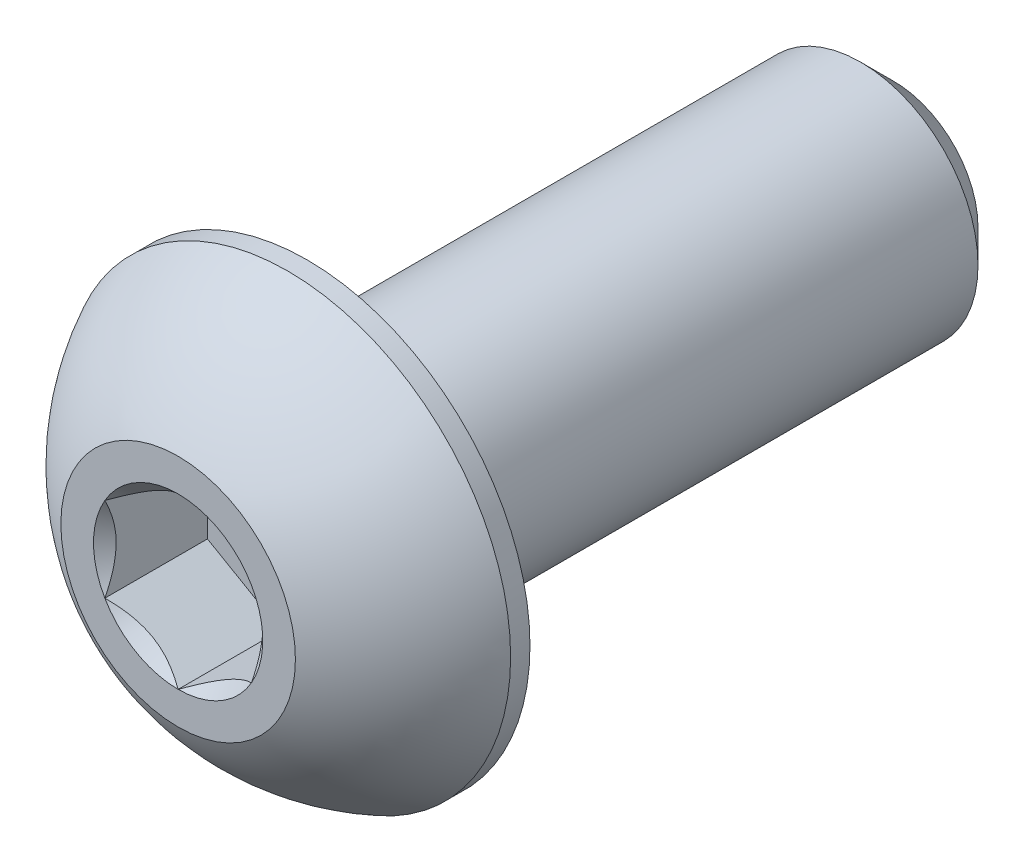
ISO-10303-21;
HEADER;
FILE_DESCRIPTION(('STEP AP214'),'2;1');
FILE_NAME('part.step','',(''),(''),'','','');
FILE_SCHEMA(('AUTOMOTIVE_DESIGN { 1 0 10303 214 1 1 1 1 }'));
ENDSEC;
DATA;
#1=APPLICATION_CONTEXT('core data for automotive mechanical design processes');
#2=APPLICATION_PROTOCOL_DEFINITION('international standard','automotive_design',2000,#1);
#3=PRODUCT_CONTEXT('',#1,'mechanical');
#4=PRODUCT('Part','Part','',(#3));
#5=PRODUCT_RELATED_PRODUCT_CATEGORY('part','',(#4));
#6=PRODUCT_DEFINITION_FORMATION('','',#4);
#7=PRODUCT_DEFINITION_CONTEXT('part definition',#1,'design');
#8=PRODUCT_DEFINITION('design','',#6,#7);
#9=PRODUCT_DEFINITION_SHAPE('','',#8);
#10=(LENGTH_UNIT() NAMED_UNIT(*) SI_UNIT(.MILLI.,.METRE.));
#11=(NAMED_UNIT(*) PLANE_ANGLE_UNIT() SI_UNIT($,.RADIAN.));
#12=(NAMED_UNIT(*) SI_UNIT($,.STERADIAN.) SOLID_ANGLE_UNIT());
#13=UNCERTAINTY_MEASURE_WITH_UNIT(LENGTH_MEASURE(1.E-05),#10,'distance_accuracy_value','');
#14=(GEOMETRIC_REPRESENTATION_CONTEXT(3) GLOBAL_UNCERTAINTY_ASSIGNED_CONTEXT((#13)) GLOBAL_UNIT_ASSIGNED_CONTEXT((#10,
#11,#12)) REPRESENTATION_CONTEXT('',''));
#15=CARTESIAN_POINT('',(0.,0.,0.));
#16=DIRECTION('',(0.,0.,1.));
#17=DIRECTION('',(1.,0.,0.));
#18=AXIS2_PLACEMENT_3D('',#15,#16,#17);
#19=CARTESIAN_POINT('',(0.,0.,6.1));
#20=DIRECTION('',(0.,0.,-1.));
#21=DIRECTION('',(-1.,0.,0.));
#22=AXIS2_PLACEMENT_3D('',#19,#20,#21);
#23=PLANE('',#22);
#24=CARTESIAN_POINT('',(0.,0.,6.1));
#25=DIRECTION('',(0.,0.,1.));
#26=DIRECTION('',(1.,0.,0.));
#27=AXIS2_PLACEMENT_3D('',#24,#25,#26);
#28=CIRCLE('',#27,1.44337567297406);
#29=CARTESIAN_POINT('',(-1.25,0.721687836487033,6.1));
#30=VERTEX_POINT('',#29);
#31=CARTESIAN_POINT('',(-1.25,-0.721687836487033,6.1));
#32=VERTEX_POINT('',#31);
#33=EDGE_CURVE('E138',#30,#32,#28,.T.);
#34=ORIENTED_EDGE('',*,*,#33,.F.);
#35=CARTESIAN_POINT('',(0.,1.44337567297406,6.1));
#36=VERTEX_POINT('',#35);
#37=EDGE_CURVE('E110',#36,#30,#28,.T.);
#38=ORIENTED_EDGE('',*,*,#37,.F.);
#39=CARTESIAN_POINT('',(1.25,0.721687836487032,6.1));
#40=VERTEX_POINT('',#39);
#41=EDGE_CURVE('E101',#40,#36,#28,.T.);
#42=ORIENTED_EDGE('',*,*,#41,.F.);
#43=CARTESIAN_POINT('',(1.25,-0.721687836487032,6.1));
#44=VERTEX_POINT('',#43);
#45=EDGE_CURVE('E62',#44,#40,#28,.T.);
#46=ORIENTED_EDGE('',*,*,#45,.F.);
#47=CARTESIAN_POINT('',(0.,-1.44337567297406,6.1));
#48=VERTEX_POINT('',#47);
#49=EDGE_CURVE('E69',#48,#44,#28,.T.);
#50=ORIENTED_EDGE('',*,*,#49,.F.);
#51=EDGE_CURVE('E139',#32,#48,#28,.T.);
#52=ORIENTED_EDGE('',*,*,#51,.F.);
#53=EDGE_LOOP('',(#34,#38,#42,#46,#50,#52));
#54=FACE_BOUND('',#53,.T.);
#55=CARTESIAN_POINT('',(0.,0.,6.1));
#56=DIRECTION('',(0.,0.,1.));
#57=DIRECTION('',(1.,0.,0.));
#58=AXIS2_PLACEMENT_3D('',#55,#56,#57);
#59=CIRCLE('',#58,2.);
#60=CARTESIAN_POINT('',(0.,2.,6.1));
#61=VERTEX_POINT('',#60);
#62=EDGE_CURVE('E56',#61,#61,#59,.T.);
#63=ORIENTED_EDGE('',*,*,#62,.T.);
#64=EDGE_LOOP('',(#63));
#65=FACE_BOUND('',#64,.T.);
#66=ADVANCED_FACE('F43',(#54,#65),#23,.F.);
#67=CARTESIAN_POINT('',(0.,0.,2.37355614973262));
#68=DIRECTION('',(0.,0.,1.));
#69=DIRECTION('',(0.,1.,0.));
#70=AXIS2_PLACEMENT_3D('',#67,#68,#69);
#71=SPHERICAL_SURFACE('',#70,4.22922968981298);
#72=CARTESIAN_POINT('',(0.,0.,4.23));
#73=DIRECTION('',(0.,0.,1.));
#74=DIRECTION('',(1.,0.,0.));
#75=AXIS2_PLACEMENT_3D('',#72,#73,#74);
#76=CIRCLE('',#75,3.8);
#77=CARTESIAN_POINT('',(0.,3.8,4.23));
#78=VERTEX_POINT('',#77);
#79=EDGE_CURVE('E221',#78,#78,#76,.T.);
#80=CARTESIAN_POINT('',(0.,2.,6.1));
#81=CARTESIAN_POINT('',(0.,2.02421343985614,6.08700457403551));
#82=CARTESIAN_POINT('',(0.,2.04830018323974,6.07377308703487));
#83=CARTESIAN_POINT('',(0.,2.09621120342126,6.04684315849425));
#84=CARTESIAN_POINT('',(0.,2.12003548021917,6.03314471695428));
#85=CARTESIAN_POINT('',(0.,2.16741249358867,6.00528604686797));
#86=CARTESIAN_POINT('',(0.,2.19096523016026,5.99112581832164));
#87=CARTESIAN_POINT('',(0.,2.23779021933682,5.96234896476405));
#88=CARTESIAN_POINT('',(0.,2.2610624719418,5.94773233975278));
#89=CARTESIAN_POINT('',(0.,2.30731764886072,5.91804824448586));
#90=CARTESIAN_POINT('',(0.,2.33030057317465,5.90298077423021));
#91=CARTESIAN_POINT('',(0.,2.37596836104235,5.87240071441713));
#92=CARTESIAN_POINT('',(0.,2.39865322459612,5.85688812485971));
#93=CARTESIAN_POINT('',(0.,2.44371627121513,5.82542372060412));
#94=CARTESIAN_POINT('',(0.,2.46609445428038,5.80947190590595));
#95=CARTESIAN_POINT('',(0.,2.51053563686181,5.77713511266833));
#96=CARTESIAN_POINT('',(0.,2.532598636378,5.76075013412888));
#97=CARTESIAN_POINT('',(0.,2.57640106852492,5.72755323903277));
#98=CARTESIAN_POINT('',(0.,2.59814050115564,5.71074132247611));
#99=CARTESIAN_POINT('',(0.,2.64128753915153,5.67669693941185));
#100=CARTESIAN_POINT('',(0.,2.66269514451671,5.65946447290426));
#101=CARTESIAN_POINT('',(0.,2.70517039368395,5.62458553779704));
#102=CARTESIAN_POINT('',(0.,2.72623803748602,5.6069390691974));
#103=CARTESIAN_POINT('',(0.,2.76802535840618,5.57123883507559));
#104=CARTESIAN_POINT('',(0.,2.78874503552428,5.55318506955341));
#105=CARTESIAN_POINT('',(0.,2.82982855017313,5.51667710151719));
#106=CARTESIAN_POINT('',(0.,2.85019238770389,5.49822289900316));
#107=CARTESIAN_POINT('',(0.,2.89055648548394,5.46092106906898));
#108=CARTESIAN_POINT('',(0.,2.91055674573324,5.44207344164884));
#109=CARTESIAN_POINT('',(0.,2.95018608940553,5.40399192347874));
#110=CARTESIAN_POINT('',(0.,2.96981517282852,5.38475803272878));
#111=CARTESIAN_POINT('',(0.,3.00869470434027,5.34591129624471));
#112=CARTESIAN_POINT('',(0.,3.02794515242903,5.3262984505106));
#113=CARTESIAN_POINT('',(0.,3.06606009863533,5.28670125639628));
#114=CARTESIAN_POINT('',(0.,3.08492459675287,5.26671690801607));
#115=CARTESIAN_POINT('',(0.,3.12226047503002,5.22638430210832));
#116=CARTESIAN_POINT('',(0.,3.14073185518965,5.20603604458079));
#117=CARTESIAN_POINT('',(0.,3.17727447893821,5.16498335215256));
#118=CARTESIAN_POINT('',(0.,3.19534572252715,5.14427891725186));
#119=CARTESIAN_POINT('',(0.,3.23108120656242,5.10252173718901));
#120=CARTESIAN_POINT('',(0.,3.24874544700875,5.08146899202686));
#121=CARTESIAN_POINT('',(0.,3.28366021283673,5.03902319090103));
#122=CARTESIAN_POINT('',(0.,3.30091073821838,5.01763013493736));
#123=CARTESIAN_POINT('',(0.,3.33499151919534,4.97451184097717));
#124=CARTESIAN_POINT('',(0.,3.35182177479064,4.95278660298064));
#125=CARTESIAN_POINT('',(0.,3.38505562116371,4.9090121999432));
#126=CARTESIAN_POINT('',(0.,3.40145921194149,4.88696303490229));
#127=CARTESIAN_POINT('',(0.,3.43383349577047,4.84254915584848));
#128=CARTESIAN_POINT('',(0.,3.44980418882166,4.8201844418356));
#129=CARTESIAN_POINT('',(0.,3.48130660877275,4.77514796280767));
#130=CARTESIAN_POINT('',(0.,3.49683833567264,4.75247619779264));
#131=CARTESIAN_POINT('',(0.,3.52745692170931,4.70683423141033));
#132=CARTESIAN_POINT('',(0.,3.5425437808461,4.68386403004306));
#133=CARTESIAN_POINT('',(0.,3.57226689871518,4.63763391896935));
#134=CARTESIAN_POINT('',(0.,3.58690315744748,4.61437400926291));
#135=CARTESIAN_POINT('',(0.,3.61571951333199,4.56757331973341));
#136=CARTESIAN_POINT('',(0.,3.62989961048422,4.54403253991033));
#137=CARTESIAN_POINT('',(0.,3.65779825442823,4.4966790546141));
#138=CARTESIAN_POINT('',(0.,3.67151680122002,4.47286634914094));
#139=CARTESIAN_POINT('',(0.,3.69848713452321,4.42497806212234));
#140=CARTESIAN_POINT('',(0.,3.71173892103461,4.4009024805769));
#141=CARTESIAN_POINT('',(0.,3.73777068821038,4.35249758420785));
#142=CARTESIAN_POINT('',(0.,3.75055066887474,4.32816826938425));
#143=CARTESIAN_POINT('',(0.,3.77563400658953,4.27926517055481));
#144=CARTESIAN_POINT('',(0.,3.78793736363997,4.25469138654898));
#145=CARTESIAN_POINT('',(0.,3.8,4.23));
#146=B_SPLINE_CURVE_WITH_KNOTS('',3,(#80,#81,#82,#83,#84,#85,#86,#87,#88,#89,#90,#91,#92,#93,
#94,#95,#96,#97,#98,#99,#100,#101,#102,#103,#104,#105,#106,#107,#108,#109,#110,#111,#112,#113,
#114,#115,#116,#117,#118,#119,#120,#121,#122,#123,#124,#125,#126,#127,#128,#129,#130,#131,#132,
#133,#134,#135,#136,#137,#138,#139,#140,#141,#142,#143,#144,#145),.UNSPECIFIED.,.F.,.F.,(4,2,2,
2,2,2,2,2,2,2,2,2,2,2,2,2,2,2,2,2,2,2,2,2,2,2,2,2,2,2,2,2,4),(0.,0.0824398589102646,
0.164879717820529,0.247319576730793,0.329759435641058,0.412199294551322,0.494639153461587,
0.57707901237185,0.659518871282115,0.741958730192379,0.824398589102644,0.906838448012908,
0.989278306923172,1.07171816583344,1.1541580247437,1.23659788365396,1.31903774256423,
1.40147760147449,1.48391746038476,1.56635731929502,1.64879717820529,1.73123703711555,
1.81367689602582,1.89611675493608,1.97855661384634,2.06099647275661,2.14343633166687,
2.22587619057714,2.3083160494874,2.39075590839767,2.47319576730793,2.55563562621819,
2.63807548512846),.UNSPECIFIED.);
#147=EDGE_CURVE('BSEAM226',#61,#78,#146,.T.);
#148=ORIENTED_EDGE('',*,*,#62,.F.);
#149=ORIENTED_EDGE('',*,*,#79,.T.);
#150=ORIENTED_EDGE('',*,*,#147,.T.);
#151=ORIENTED_EDGE('',*,*,#147,.F.);
#152=EDGE_LOOP('',(#148,#150,#149,#151));
#153=FACE_BOUND('',#152,.T.);
#154=ADVANCED_FACE('F226',(#153),#71,.T.);
#155=CARTESIAN_POINT('',(0.,0.,6.1));
#156=DIRECTION('',(0.,0.,1.));
#157=DIRECTION('',(1.,0.,0.));
#158=AXIS2_PLACEMENT_3D('',#155,#156,#157);
#159=CYLINDRICAL_SURFACE('',#158,3.8);
#160=ORIENTED_EDGE('',*,*,#79,.F.);
#161=EDGE_LOOP('',(#160));
#162=FACE_BOUND('',#161,.T.);
#163=CARTESIAN_POINT('',(0.,0.,3.9));
#164=DIRECTION('',(0.,0.,1.));
#165=DIRECTION('',(1.,0.,0.));
#166=AXIS2_PLACEMENT_3D('',#163,#164,#165);
#167=CIRCLE('',#166,3.8);
#168=CARTESIAN_POINT('',(3.8,0.,3.9));
#169=VERTEX_POINT('',#168);
#170=EDGE_CURVE('E218',#169,#169,#167,.T.);
#171=ORIENTED_EDGE('',*,*,#170,.T.);
#172=EDGE_LOOP('',(#171));
#173=FACE_BOUND('',#172,.T.);
#174=ADVANCED_FACE('F229',(#162,#173),#159,.T.);
#175=CARTESIAN_POINT('',(0.,2.,3.9));
#176=DIRECTION('',(0.,0.,1.));
#177=DIRECTION('',(1.,0.,0.));
#178=AXIS2_PLACEMENT_3D('',#175,#176,#177);
#179=PLANE('',#178);
#180=ORIENTED_EDGE('',*,*,#170,.F.);
#181=EDGE_LOOP('',(#180));
#182=FACE_BOUND('',#181,.T.);
#183=CARTESIAN_POINT('',(0.,0.,3.9));
#184=DIRECTION('',(0.,0.,1.));
#185=DIRECTION('',(1.,0.,0.));
#186=AXIS2_PLACEMENT_3D('',#183,#184,#185);
#187=CIRCLE('',#186,2.);
#188=CARTESIAN_POINT('',(2.,0.,3.9));
#189=VERTEX_POINT('',#188);
#190=EDGE_CURVE('E215',#189,#189,#187,.T.);
#191=ORIENTED_EDGE('',*,*,#190,.T.);
#192=EDGE_LOOP('',(#191));
#193=FACE_BOUND('',#192,.T.);
#194=ADVANCED_FACE('F234',(#182,#193),#179,.F.);
#195=CARTESIAN_POINT('',(0.,0.,6.1));
#196=DIRECTION('',(0.,0.,1.));
#197=DIRECTION('',(1.,0.,0.));
#198=AXIS2_PLACEMENT_3D('',#195,#196,#197);
#199=CYLINDRICAL_SURFACE('',#198,2.);
#200=ORIENTED_EDGE('',*,*,#190,.F.);
#201=EDGE_LOOP('',(#200));
#202=FACE_BOUND('',#201,.T.);
#203=CARTESIAN_POINT('',(0.,0.,-5.54));
#204=DIRECTION('',(0.,0.,1.));
#205=DIRECTION('',(1.,0.,0.));
#206=AXIS2_PLACEMENT_3D('',#203,#204,#205);
#207=CIRCLE('',#206,2.);
#208=CARTESIAN_POINT('',(2.,0.,-5.54));
#209=VERTEX_POINT('',#208);
#210=EDGE_CURVE('E212',#209,#209,#207,.T.);
#211=ORIENTED_EDGE('',*,*,#210,.T.);
#212=EDGE_LOOP('',(#211));
#213=FACE_BOUND('',#212,.T.);
#214=ADVANCED_FACE('F240',(#202,#213),#199,.T.);
#215=CARTESIAN_POINT('',(0.,0.,-6.1));
#216=DIRECTION('',(0.,0.,1.));
#217=DIRECTION('',(1.,0.,0.));
#218=AXIS2_PLACEMENT_3D('',#215,#216,#217);
#219=CONICAL_SURFACE('',#218,1.44,0.785398163397445);
#220=ORIENTED_EDGE('',*,*,#210,.F.);
#221=EDGE_LOOP('',(#220));
#222=FACE_BOUND('',#221,.T.);
#223=CARTESIAN_POINT('',(0.,0.,-6.1));
#224=DIRECTION('',(0.,0.,1.));
#225=DIRECTION('',(1.,0.,0.));
#226=AXIS2_PLACEMENT_3D('',#223,#224,#225);
#227=CIRCLE('',#226,1.44);
#228=CARTESIAN_POINT('',(1.44,0.,-6.1));
#229=VERTEX_POINT('',#228);
#230=EDGE_CURVE('E199',#229,#229,#227,.T.);
#231=ORIENTED_EDGE('',*,*,#230,.T.);
#232=EDGE_LOOP('',(#231));
#233=FACE_BOUND('',#232,.T.);
#234=ADVANCED_FACE('F246',(#222,#233),#219,.T.);
#235=CARTESIAN_POINT('',(0.,0.,-6.1));
#236=DIRECTION('',(0.,0.,1.));
#237=DIRECTION('',(1.,0.,0.));
#238=AXIS2_PLACEMENT_3D('',#235,#236,#237);
#239=PLANE('',#238);
#240=ORIENTED_EDGE('',*,*,#230,.F.);
#241=EDGE_LOOP('',(#240));
#242=FACE_BOUND('',#241,.T.);
#243=ADVANCED_FACE('F172',(#242),#239,.F.);
#244=CARTESIAN_POINT('',(0.,0.,6.1));
#245=DIRECTION('',(0.,0.,1.));
#246=DIRECTION('',(1.,0.,0.));
#247=AXIS2_PLACEMENT_3D('',#244,#245,#246);
#248=CONICAL_SURFACE('',#247,1.44337567297406,0.78539816339745);
#249=ORIENTED_EDGE('',*,*,#37,.T.);
#250=CARTESIAN_POINT('',(0.000199999999999987,1.4434911430279,6.10011548390914));
#251=CARTESIAN_POINT('',(-0.0427751670715869,1.41867941875065,6.07532166805511));
#252=CARTESIAN_POINT('',(-0.0864690047459484,1.39345276980743,6.05198373441868));
#253=CARTESIAN_POINT('',(-0.175565930841942,1.34201263554194,6.00925200408454));
#254=CARTESIAN_POINT('',(-0.220977498357064,1.31579425481276,5.98988199236041));
#255=CARTESIAN_POINT('',(-0.31254782093526,1.26292610442246,5.95670048341348));
#256=CARTESIAN_POINT('',(-0.358683240175886,1.23628980770471,5.94280555905266));
#257=CARTESIAN_POINT('',(-0.451970080407593,1.18243062538508,5.92139728216064));
#258=CARTESIAN_POINT('',(-0.49911864913638,1.15520938653761,5.91386794156679));
#259=CARTESIAN_POINT('',(-0.580373556887253,1.10829684367467,5.9070744980507));
#260=CARTESIAN_POINT('',(-0.614374876627941,1.08866617256958,5.90606855910435));
#261=CARTESIAN_POINT('',(-0.682317764432478,1.04943932800611,5.90776141491132));
#262=CARTESIAN_POINT('',(-0.716259317655658,1.02984316311599,5.91046102721554));
#263=CARTESIAN_POINT('',(-0.7838148564575,0.990839954603499,5.91940893031638));
#264=CARTESIAN_POINT('',(-0.817428507286775,0.971433104248771,5.92566052589971));
#265=CARTESIAN_POINT('',(-0.884094638217813,0.932943395609905,5.94137568141391));
#266=CARTESIAN_POINT('',(-0.917146871030296,0.913860680098301,5.95084062008746));
#267=CARTESIAN_POINT('',(-1.00179969160026,0.864986351354568,5.97893139068759));
#268=CARTESIAN_POINT('',(-1.05286649242964,0.835502920149076,5.9996701574522));
#269=CARTESIAN_POINT('',(-1.15300085411325,0.777690319475909,6.04638713467148));
#270=CARTESIAN_POINT('',(-1.20207431157827,0.749357745598417,6.07234829594677));
#271=CARTESIAN_POINT('',(-1.2502,0.721572366433195,6.10011548390914));
#272=B_SPLINE_CURVE_WITH_KNOTS('',3,(#250,#251,#252,#253,#254,#255,#256,#257,#258,#259,#260,
#261,#262,#263,#264,#265,#266,#267,#268,#269,#270,#271),.UNSPECIFIED.,.F.,.F.,(4,2,2,2,2,2,2,2,
2,2,4),(0.,0.166533409618304,0.334037607289762,0.498880396489699,0.663307919240275,
0.780963963458827,0.898645970148453,1.01643764860773,1.1342799317155,1.32148652032141,
1.50809158792573),.UNSPECIFIED.);
#273=EDGE_CURVE('E11',#36,#30,#272,.T.);
#274=ORIENTED_EDGE('',*,*,#273,.F.);
#275=EDGE_LOOP('',(#249,#274));
#276=FACE_BOUND('',#275,.T.);
#277=ADVANCED_FACE('F114',(#276),#248,.F.);
#278=ORIENTED_EDGE('',*,*,#33,.T.);
#279=CARTESIAN_POINT('',(-1.25,-1.43934010808077,6.56298209689233));
#280=CARTESIAN_POINT('',(-1.25,-1.40429313005659,6.53652492263289));
#281=CARTESIAN_POINT('',(-1.25,-1.36905087135599,6.51032716035428));
#282=CARTESIAN_POINT('',(-1.25,-1.29809650706311,6.45855757183958));
#283=CARTESIAN_POINT('',(-1.25,-1.26238428576495,6.43298590435629));
#284=CARTESIAN_POINT('',(-1.25,-1.15390111792708,6.35700599368946));
#285=CARTESIAN_POINT('',(-1.25,-1.08031646726264,6.30774028618957));
#286=CARTESIAN_POINT('',(-1.25,-0.926012322755095,6.21102583026313));
#287=CARTESIAN_POINT('',(-1.25,-0.845125318656146,6.1638412989418));
#288=CARTESIAN_POINT('',(-1.25,-0.679311174076602,6.07753073439041));
#289=CARTESIAN_POINT('',(-1.25,-0.594398891026687,6.0383775346269));
#290=CARTESIAN_POINT('',(-1.25,-0.46694481246074,5.99047722368829));
#291=CARTESIAN_POINT('',(-1.25,-0.426289985812821,5.97672948978634));
#292=CARTESIAN_POINT('',(-1.25,-0.343998850091267,5.95249792745054));
#293=CARTESIAN_POINT('',(-1.25,-0.302362473614962,5.94201432386977));
#294=CARTESIAN_POINT('',(-1.25,-0.219052696285665,5.9250301617483));
#295=CARTESIAN_POINT('',(-1.25,-0.1773934284745,5.91846136047137));
#296=CARTESIAN_POINT('',(-1.25,-0.0936293693401921,5.90943505345776));
#297=CARTESIAN_POINT('',(-1.25,-0.0515246558543961,5.90697684099727));
#298=CARTESIAN_POINT('',(-1.25,0.0311890576306314,5.90635406201329));
#299=CARTESIAN_POINT('',(-1.25,0.0717969625499302,5.90803711684625));
#300=CARTESIAN_POINT('',(-1.25,0.152668636885197,5.91526827059791));
#301=CARTESIAN_POINT('',(-1.25,0.192932338835358,5.92081711041311));
#302=CARTESIAN_POINT('',(-1.25,0.273499879165295,5.93557103646495));
#303=CARTESIAN_POINT('',(-1.25,0.313792180618511,5.94483817596411));
#304=CARTESIAN_POINT('',(-1.25,0.393496413911457,5.96653617845735));
#305=CARTESIAN_POINT('',(-1.25,0.432908419115059,5.97896677673065));
#306=CARTESIAN_POINT('',(-1.25,0.556992735862298,6.02277935293144));
#307=CARTESIAN_POINT('',(-1.25,0.639898924666085,6.05915107287596));
#308=CARTESIAN_POINT('',(-1.25,0.801816555499701,6.14001916217834));
#309=CARTESIAN_POINT('',(-1.25,0.880812666325044,6.18454472091199));
#310=CARTESIAN_POINT('',(-1.25,1.0317856127975,6.27640487666662));
#311=CARTESIAN_POINT('',(-1.25,1.10391618485086,6.32348993391625));
#312=CARTESIAN_POINT('',(-1.25,1.2101860604331,6.39627856159854));
#313=CARTESIAN_POINT('',(-1.25,1.24515069969379,6.42079808539336));
#314=CARTESIAN_POINT('',(-1.25,1.31460220852736,6.47048563676568));
#315=CARTESIAN_POINT('',(-1.25,1.34908920596618,6.49565348541552));
#316=CARTESIAN_POINT('',(-1.25,1.38337731682911,6.52109014884121));
#317=B_SPLINE_CURVE_WITH_KNOTS('',3,(#279,#280,#281,#282,#283,#284,#285,#286,#287,#288,#289,
#290,#291,#292,#293,#294,#295,#296,#297,#298,#299,#300,#301,#302,#303,#304,#305,#306,#307,#308,
#309,#310,#311,#312,#313,#314,#315,#316),.UNSPECIFIED.,.F.,.F.,(4,2,2,2,2,2,2,2,2,2,2,2,2,2,2,2,
2,2,4),(0.,0.131732960381448,0.263498984161645,0.529042014455825,0.809741926134618,
1.08947609717225,1.21811634272576,1.346765447839,1.47310084517844,1.59941451973784,
1.72115042167849,1.84290966131735,1.96679153905341,2.09066305366039,2.36146692896009,
2.63325989198491,2.89154668212279,3.01965734507713,3.14773302245628),.UNSPECIFIED.);
#318=EDGE_CURVE('E109',#30,#32,#317,.F.);
#319=ORIENTED_EDGE('',*,*,#318,.F.);
#320=EDGE_LOOP('',(#278,#319));
#321=FACE_BOUND('',#320,.T.);
#322=ADVANCED_FACE('F259',(#321),#248,.F.);
#323=ORIENTED_EDGE('',*,*,#51,.T.);
#324=CARTESIAN_POINT('',(-1.2502,-0.721572366433194,6.10011548390914));
#325=CARTESIAN_POINT('',(-1.20722483292841,-0.746384090710444,6.0753216680551));
#326=CARTESIAN_POINT('',(-1.16353099525405,-0.771610739653664,6.05198373441868));
#327=CARTESIAN_POINT('',(-1.07443406915806,-0.823050873919154,6.00925200408454));
#328=CARTESIAN_POINT('',(-1.02902250164294,-0.849269254648333,5.98988199236041));
#329=CARTESIAN_POINT('',(-0.937452179064741,-0.902137405038635,5.95670048341348));
#330=CARTESIAN_POINT('',(-0.891316759824115,-0.928773701756387,5.94280555905266));
#331=CARTESIAN_POINT('',(-0.798029919592409,-0.982632884076012,5.92139728216064));
#332=CARTESIAN_POINT('',(-0.750881350863621,-1.00985412292348,5.91386794156679));
#333=CARTESIAN_POINT('',(-0.669626443112749,-1.05676666578643,5.9070744980507));
#334=CARTESIAN_POINT('',(-0.63562512337206,-1.07639733689152,5.90606855910435));
#335=CARTESIAN_POINT('',(-0.567682235567524,-1.11562418145499,5.90776141491132));
#336=CARTESIAN_POINT('',(-0.533740682344344,-1.1352203463451,5.91046102721554));
#337=CARTESIAN_POINT('',(-0.466185143542502,-1.1742235548576,5.91940893031638));
#338=CARTESIAN_POINT('',(-0.432571492713226,-1.19363040521233,5.92566052589971));
#339=CARTESIAN_POINT('',(-0.365905361782188,-1.23212011385119,5.9413756814139));
#340=CARTESIAN_POINT('',(-0.332853128969706,-1.2512028293628,5.95084062008746));
#341=CARTESIAN_POINT('',(-0.248200308399737,-1.30007715810653,5.97893139068759));
#342=CARTESIAN_POINT('',(-0.197133507570363,-1.32956058931202,5.9996701574522));
#343=CARTESIAN_POINT('',(-0.0969991458867461,-1.38737318998519,6.04638713467148));
#344=CARTESIAN_POINT('',(-0.0479256884217312,-1.41570576386268,6.07234829594677));
#345=CARTESIAN_POINT('',(0.000199999999999486,-1.4434911430279,6.10011548390914));
#346=B_SPLINE_CURVE_WITH_KNOTS('',3,(#324,#325,#326,#327,#328,#329,#330,#331,#332,#333,#334,
#335,#336,#337,#338,#339,#340,#341,#342,#343,#344,#345),.UNSPECIFIED.,.F.,.F.,(4,2,2,2,2,2,2,2,
2,2,4),(0.,0.166533409618303,0.334037607289761,0.498880396489697,0.663307919240273,
0.780963963458825,0.898645970148451,1.01643764860773,1.13427993171549,1.32148652032141,
1.50809158792573),.UNSPECIFIED.);
#347=EDGE_CURVE('E148',#32,#48,#346,.T.);
#348=ORIENTED_EDGE('',*,*,#347,.F.);
#349=EDGE_LOOP('',(#323,#348));
#350=FACE_BOUND('',#349,.T.);
#351=ADVANCED_FACE('F277',(#350),#248,.F.);
#352=ORIENTED_EDGE('',*,*,#49,.T.);
#353=CARTESIAN_POINT('',(-0.000200000000000272,-1.4434911430279,6.10011548390914));
#354=CARTESIAN_POINT('',(0.0427751670715864,-1.41867941875065,6.0753216680551));
#355=CARTESIAN_POINT('',(0.0864690047459478,-1.39345276980743,6.05198373441868));
#356=CARTESIAN_POINT('',(0.175565930841942,-1.34201263554194,6.00925200408454));
#357=CARTESIAN_POINT('',(0.220977498357063,-1.31579425481276,5.98988199236041));
#358=CARTESIAN_POINT('',(0.312547820935259,-1.26292610442246,5.95670048341348));
#359=CARTESIAN_POINT('',(0.358683240175885,-1.23628980770471,5.94280555905266));
#360=CARTESIAN_POINT('',(0.451970080407592,-1.18243062538508,5.92139728216064));
#361=CARTESIAN_POINT('',(0.499118649136379,-1.15520938653761,5.91386794156679));
#362=CARTESIAN_POINT('',(0.580373556887252,-1.10829684367467,5.9070744980507));
#363=CARTESIAN_POINT('',(0.61437487662794,-1.08866617256958,5.90606855910435));
#364=CARTESIAN_POINT('',(0.682317764432477,-1.04943932800611,5.90776141491132));
#365=CARTESIAN_POINT('',(0.716259317655657,-1.02984316311599,5.91046102721554));
#366=CARTESIAN_POINT('',(0.783814856457499,-0.990839954603499,5.91940893031638));
#367=CARTESIAN_POINT('',(0.817428507286775,-0.971433104248771,5.92566052589971));
#368=CARTESIAN_POINT('',(0.884094638217813,-0.932943395609905,5.9413756814139));
#369=CARTESIAN_POINT('',(0.917146871030295,-0.9138606800983,5.95084062008746));
#370=CARTESIAN_POINT('',(1.00179969160026,-0.864986351354568,5.97893139068759));
#371=CARTESIAN_POINT('',(1.05286649242964,-0.835502920149076,5.9996701574522));
#372=CARTESIAN_POINT('',(1.15300085411325,-0.777690319475908,6.04638713467148));
#373=CARTESIAN_POINT('',(1.20207431157827,-0.749357745598417,6.07234829594677));
#374=CARTESIAN_POINT('',(1.2502,-0.721572366433194,6.10011548390914));
#375=B_SPLINE_CURVE_WITH_KNOTS('',3,(#353,#354,#355,#356,#357,#358,#359,#360,#361,#362,#363,
#364,#365,#366,#367,#368,#369,#370,#371,#372,#373,#374),.UNSPECIFIED.,.F.,.F.,(4,2,2,2,2,2,2,2,
2,2,4),(0.,0.166533409618304,0.334037607289761,0.498880396489698,0.663307919240274,
0.780963963458826,0.898645970148452,1.01643764860773,1.13427993171549,1.32148652032141,
1.50809158792574),.UNSPECIFIED.);
#376=EDGE_CURVE('E362',#48,#44,#375,.T.);
#377=ORIENTED_EDGE('',*,*,#376,.F.);
#378=EDGE_LOOP('',(#352,#377));
#379=FACE_BOUND('',#378,.T.);
#380=ADVANCED_FACE('F285',(#379),#248,.F.);
#381=ORIENTED_EDGE('',*,*,#45,.T.);
#382=CARTESIAN_POINT('',(1.25,-1.43934010808077,6.56298209689233));
#383=CARTESIAN_POINT('',(1.25,-1.40429313005659,6.53652492263289));
#384=CARTESIAN_POINT('',(1.25,-1.36905087135599,6.51032716035428));
#385=CARTESIAN_POINT('',(1.25,-1.29809650706311,6.45855757183959));
#386=CARTESIAN_POINT('',(1.25,-1.26238428576495,6.43298590435629));
#387=CARTESIAN_POINT('',(1.25,-1.15390111792708,6.35700599368946));
#388=CARTESIAN_POINT('',(1.25,-1.08031646726264,6.30774028618957));
#389=CARTESIAN_POINT('',(1.25,-0.926012322755096,6.21102583026313));
#390=CARTESIAN_POINT('',(1.25,-0.845125318656147,6.1638412989418));
#391=CARTESIAN_POINT('',(1.25,-0.679311174076602,6.07753073439041));
#392=CARTESIAN_POINT('',(1.25,-0.594398891026687,6.0383775346269));
#393=CARTESIAN_POINT('',(1.25,-0.46694481246074,5.99047722368829));
#394=CARTESIAN_POINT('',(1.25,-0.426289985812821,5.97672948978634));
#395=CARTESIAN_POINT('',(1.25,-0.343998850091267,5.95249792745054));
#396=CARTESIAN_POINT('',(1.25,-0.302362473614962,5.94201432386977));
#397=CARTESIAN_POINT('',(1.25,-0.219052696285665,5.9250301617483));
#398=CARTESIAN_POINT('',(1.25,-0.177393428474499,5.91846136047137));
#399=CARTESIAN_POINT('',(1.25,-0.0936293693401918,5.90943505345776));
#400=CARTESIAN_POINT('',(1.25,-0.0515246558543957,5.90697684099727));
#401=CARTESIAN_POINT('',(1.25,0.0311890576306319,5.90635406201329));
#402=CARTESIAN_POINT('',(1.25,0.0717969625499307,5.90803711684625));
#403=CARTESIAN_POINT('',(1.25,0.152668636885197,5.91526827059791));
#404=CARTESIAN_POINT('',(1.25,0.192932338835358,5.92081711041311));
#405=CARTESIAN_POINT('',(1.25,0.273499879165296,5.93557103646495));
#406=CARTESIAN_POINT('',(1.25,0.313792180618511,5.94483817596411));
#407=CARTESIAN_POINT('',(1.25,0.393496413911457,5.96653617845735));
#408=CARTESIAN_POINT('',(1.25,0.432908419115059,5.97896677673065));
#409=CARTESIAN_POINT('',(1.25,0.556992735862299,6.02277935293144));
#410=CARTESIAN_POINT('',(1.25,0.639898924666087,6.05915107287596));
#411=CARTESIAN_POINT('',(1.25,0.801816555499703,6.14001916217834));
#412=CARTESIAN_POINT('',(1.25,0.880812666325046,6.18454472091199));
#413=CARTESIAN_POINT('',(1.25,1.0317856127975,6.27640487666663));
#414=CARTESIAN_POINT('',(1.25,1.10391618485086,6.32348993391625));
#415=CARTESIAN_POINT('',(1.25,1.21018606043311,6.39627856159854));
#416=CARTESIAN_POINT('',(1.25,1.2451506996938,6.42079808539336));
#417=CARTESIAN_POINT('',(1.25,1.31460220852737,6.47048563676568));
#418=CARTESIAN_POINT('',(1.25,1.34908920596618,6.49565348541552));
#419=CARTESIAN_POINT('',(1.25,1.38337731682912,6.52109014884122));
#420=B_SPLINE_CURVE_WITH_KNOTS('',3,(#382,#383,#384,#385,#386,#387,#388,#389,#390,#391,#392,
#393,#394,#395,#396,#397,#398,#399,#400,#401,#402,#403,#404,#405,#406,#407,#408,#409,#410,#411,
#412,#413,#414,#415,#416,#417,#418,#419),.UNSPECIFIED.,.F.,.F.,(4,2,2,2,2,2,2,2,2,2,2,2,2,2,2,2,
2,2,4),(0.,0.131732960381448,0.263498984161644,0.529042014455825,0.809741926134618,
1.08947609717225,1.21811634272577,1.346765447839,1.47310084517844,1.59941451973784,
1.72115042167849,1.84290966131735,1.96679153905342,2.09066305366039,2.36146692896009,
2.63325989198491,2.89154668212279,3.01965734507713,3.14773302245628),.UNSPECIFIED.);
#421=EDGE_CURVE('E126',#44,#40,#420,.T.);
#422=ORIENTED_EDGE('',*,*,#421,.F.);
#423=EDGE_LOOP('',(#381,#422));
#424=FACE_BOUND('',#423,.T.);
#425=ADVANCED_FACE('F293',(#424),#248,.F.);
#426=ORIENTED_EDGE('',*,*,#41,.T.);
#427=CARTESIAN_POINT('',(1.2502,0.721572366433194,6.10011548390914));
#428=CARTESIAN_POINT('',(1.20722483292841,0.746384090710444,6.07532166805511));
#429=CARTESIAN_POINT('',(1.16353099525405,0.771610739653664,6.05198373441868));
#430=CARTESIAN_POINT('',(1.07443406915806,0.823050873919155,6.00925200408454));
#431=CARTESIAN_POINT('',(1.02902250164294,0.849269254648333,5.98988199236041));
#432=CARTESIAN_POINT('',(0.937452179064741,0.902137405038635,5.95670048341348));
#433=CARTESIAN_POINT('',(0.891316759824115,0.928773701756387,5.94280555905266));
#434=CARTESIAN_POINT('',(0.798029919592408,0.982632884076012,5.92139728216064));
#435=CARTESIAN_POINT('',(0.750881350863621,1.00985412292348,5.91386794156679));
#436=CARTESIAN_POINT('',(0.669626443112748,1.05676666578643,5.9070744980507));
#437=CARTESIAN_POINT('',(0.635625123372059,1.07639733689152,5.90606855910435));
#438=CARTESIAN_POINT('',(0.567682235567523,1.11562418145499,5.90776141491132));
#439=CARTESIAN_POINT('',(0.533740682344343,1.1352203463451,5.91046102721554));
#440=CARTESIAN_POINT('',(0.466185143542501,1.1742235548576,5.91940893031638));
#441=CARTESIAN_POINT('',(0.432571492713225,1.19363040521233,5.92566052589971));
#442=CARTESIAN_POINT('',(0.365905361782187,1.23212011385119,5.9413756814139));
#443=CARTESIAN_POINT('',(0.332853128969705,1.2512028293628,5.95084062008746));
#444=CARTESIAN_POINT('',(0.248200308399736,1.30007715810653,5.97893139068759));
#445=CARTESIAN_POINT('',(0.197133507570362,1.32956058931202,5.9996701574522));
#446=CARTESIAN_POINT('',(0.0969991458867455,1.38737318998519,6.04638713467148));
#447=CARTESIAN_POINT('',(0.0479256884217307,1.41570576386268,6.07234829594677));
#448=CARTESIAN_POINT('',(-0.000200000000000086,1.4434911430279,6.10011548390914));
#449=B_SPLINE_CURVE_WITH_KNOTS('',3,(#427,#428,#429,#430,#431,#432,#433,#434,#435,#436,#437,
#438,#439,#440,#441,#442,#443,#444,#445,#446,#447,#448),.UNSPECIFIED.,.F.,.F.,(4,2,2,2,2,2,2,2,
2,2,4),(0.,0.166533409618304,0.334037607289762,0.498880396489698,0.663307919240274,
0.780963963458827,0.898645970148453,1.01643764860773,1.13427993171549,1.32148652032141,
1.50809158792574),.UNSPECIFIED.);
#450=EDGE_CURVE('E105',#40,#36,#449,.T.);
#451=ORIENTED_EDGE('',*,*,#450,.F.);
#452=EDGE_LOOP('',(#426,#451));
#453=FACE_BOUND('',#452,.T.);
#454=ADVANCED_FACE('F103',(#453),#248,.F.);
#455=CARTESIAN_POINT('',(0.,0.,4.35));
#456=DIRECTION('',(0.,0.,1.));
#457=DIRECTION('',(1.,0.,0.));
#458=AXIS2_PLACEMENT_3D('',#455,#456,#457);
#459=PLANE('',#458);
#460=DIRECTION('',(-0.866025403784439,0.5,0.));
#461=VECTOR('',#460,1.);
#462=CARTESIAN_POINT('',(1.25,0.721687836487032,4.35));
#463=LINE('',#462,#461);
#464=CARTESIAN_POINT('',(1.25,0.721687836487032,4.35));
#465=VERTEX_POINT('',#464);
#466=CARTESIAN_POINT('',(0.,1.44337567297406,4.35));
#467=VERTEX_POINT('',#466);
#468=EDGE_CURVE('E125',#465,#467,#463,.T.);
#469=ORIENTED_EDGE('',*,*,#468,.T.);
#470=DIRECTION('',(-0.866025403784439,-0.5,0.));
#471=VECTOR('',#470,1.);
#472=CARTESIAN_POINT('',(0.,1.44337567297406,4.35));
#473=LINE('',#472,#471);
#474=CARTESIAN_POINT('',(-1.25,0.721687836487033,4.35));
#475=VERTEX_POINT('',#474);
#476=EDGE_CURVE('E130',#467,#475,#473,.T.);
#477=ORIENTED_EDGE('',*,*,#476,.T.);
#478=DIRECTION('',(0.,-1.,0.));
#479=VECTOR('',#478,1.);
#480=CARTESIAN_POINT('',(-1.25,0.721687836487033,4.35));
#481=LINE('',#480,#479);
#482=CARTESIAN_POINT('',(-1.25,-0.721687836487032,4.35));
#483=VERTEX_POINT('',#482);
#484=EDGE_CURVE('E187',#475,#483,#481,.T.);
#485=ORIENTED_EDGE('',*,*,#484,.T.);
#486=DIRECTION('',(0.866025403784439,-0.5,0.));
#487=VECTOR('',#486,1.);
#488=CARTESIAN_POINT('',(-1.25,-0.721687836487032,4.35));
#489=LINE('',#488,#487);
#490=CARTESIAN_POINT('',(0.,-1.44337567297406,4.35));
#491=VERTEX_POINT('',#490);
#492=EDGE_CURVE('E190',#483,#491,#489,.T.);
#493=ORIENTED_EDGE('',*,*,#492,.T.);
#494=DIRECTION('',(0.866025403784439,0.5,0.));
#495=VECTOR('',#494,1.);
#496=CARTESIAN_POINT('',(0.,-1.44337567297406,4.35));
#497=LINE('',#496,#495);
#498=CARTESIAN_POINT('',(1.25,-0.721687836487032,4.35));
#499=VERTEX_POINT('',#498);
#500=EDGE_CURVE('E193',#491,#499,#497,.T.);
#501=ORIENTED_EDGE('',*,*,#500,.T.);
#502=DIRECTION('',(0.,1.,0.));
#503=VECTOR('',#502,1.);
#504=CARTESIAN_POINT('',(1.25,-0.721687836487032,4.35));
#505=LINE('',#504,#503);
#506=EDGE_CURVE('E133',#499,#465,#505,.T.);
#507=ORIENTED_EDGE('',*,*,#506,.T.);
#508=EDGE_LOOP('',(#469,#477,#485,#493,#501,#507));
#509=FACE_BOUND('',#508,.T.);
#510=ADVANCED_FACE('F167',(#509),#459,.T.);
#511=CARTESIAN_POINT('',(0.,1.44337567297406,4.35));
#512=DIRECTION('',(-0.5,0.866025403784439,0.));
#513=DIRECTION('',(-0.866025403784439,-0.5,0.));
#514=AXIS2_PLACEMENT_3D('',#511,#512,#513);
#515=PLANE('',#514);
#516=DIRECTION('',(0.,0.,1.));
#517=VECTOR('',#516,1.);
#518=CARTESIAN_POINT('',(0.,1.44337567297406,4.35));
#519=LINE('',#518,#517);
#520=EDGE_CURVE('E122',#467,#36,#519,.T.);
#521=ORIENTED_EDGE('',*,*,#520,.T.);
#522=ORIENTED_EDGE('',*,*,#273,.T.);
#523=DIRECTION('',(0.,0.,1.));
#524=VECTOR('',#523,1.);
#525=CARTESIAN_POINT('',(-1.25,0.721687836487033,4.35));
#526=LINE('',#525,#524);
#527=EDGE_CURVE('E132',#475,#30,#526,.T.);
#528=ORIENTED_EDGE('',*,*,#527,.F.);
#529=ORIENTED_EDGE('',*,*,#476,.F.);
#530=EDGE_LOOP('',(#521,#522,#528,#529));
#531=FACE_BOUND('',#530,.T.);
#532=ADVANCED_FACE('F128',(#531),#515,.F.);
#533=CARTESIAN_POINT('',(-1.25,0.721687836487033,4.35));
#534=DIRECTION('',(-1.,0.,0.));
#535=DIRECTION('',(0.,0.,1.));
#536=AXIS2_PLACEMENT_3D('',#533,#534,#535);
#537=PLANE('',#536);
#538=ORIENTED_EDGE('',*,*,#527,.T.);
#539=ORIENTED_EDGE('',*,*,#318,.T.);
#540=DIRECTION('',(0.,0.,1.));
#541=VECTOR('',#540,1.);
#542=CARTESIAN_POINT('',(-1.25,-0.721687836487032,4.35));
#543=LINE('',#542,#541);
#544=EDGE_CURVE('E206',#483,#32,#543,.T.);
#545=ORIENTED_EDGE('',*,*,#544,.F.);
#546=ORIENTED_EDGE('',*,*,#484,.F.);
#547=EDGE_LOOP('',(#538,#539,#545,#546));
#548=FACE_BOUND('',#547,.T.);
#549=ADVANCED_FACE('F157',(#548),#537,.F.);
#550=CARTESIAN_POINT('',(-1.25,-0.721687836487032,4.35));
#551=DIRECTION('',(-0.5,-0.866025403784438,0.));
#552=DIRECTION('',(0.866025403784439,-0.5,0.));
#553=AXIS2_PLACEMENT_3D('',#550,#551,#552);
#554=PLANE('',#553);
#555=ORIENTED_EDGE('',*,*,#544,.T.);
#556=ORIENTED_EDGE('',*,*,#347,.T.);
#557=DIRECTION('',(0.,0.,1.));
#558=VECTOR('',#557,1.);
#559=CARTESIAN_POINT('',(0.,-1.44337567297406,4.35));
#560=LINE('',#559,#558);
#561=EDGE_CURVE('E203',#491,#48,#560,.T.);
#562=ORIENTED_EDGE('',*,*,#561,.F.);
#563=ORIENTED_EDGE('',*,*,#492,.F.);
#564=EDGE_LOOP('',(#555,#556,#562,#563));
#565=FACE_BOUND('',#564,.T.);
#566=ADVANCED_FACE('F160',(#565),#554,.F.);
#567=CARTESIAN_POINT('',(0.,-1.44337567297406,4.35));
#568=DIRECTION('',(0.5,-0.866025403784439,0.));
#569=DIRECTION('',(0.866025403784439,0.5,0.));
#570=AXIS2_PLACEMENT_3D('',#567,#568,#569);
#571=PLANE('',#570);
#572=ORIENTED_EDGE('',*,*,#561,.T.);
#573=ORIENTED_EDGE('',*,*,#376,.T.);
#574=DIRECTION('',(0.,0.,1.));
#575=VECTOR('',#574,1.);
#576=CARTESIAN_POINT('',(1.25,-0.721687836487032,4.35));
#577=LINE('',#576,#575);
#578=EDGE_CURVE('E200',#499,#44,#577,.T.);
#579=ORIENTED_EDGE('',*,*,#578,.F.);
#580=ORIENTED_EDGE('',*,*,#500,.F.);
#581=EDGE_LOOP('',(#572,#573,#579,#580));
#582=FACE_BOUND('',#581,.T.);
#583=ADVANCED_FACE('F320',(#582),#571,.F.);
#584=CARTESIAN_POINT('',(1.25,-0.721687836487032,4.35));
#585=DIRECTION('',(1.,0.,0.));
#586=DIRECTION('',(0.,1.,0.));
#587=AXIS2_PLACEMENT_3D('',#584,#585,#586);
#588=PLANE('',#587);
#589=ORIENTED_EDGE('',*,*,#578,.T.);
#590=ORIENTED_EDGE('',*,*,#421,.T.);
#591=DIRECTION('',(0.,0.,1.));
#592=VECTOR('',#591,1.);
#593=CARTESIAN_POINT('',(1.25,0.721687836487032,4.35));
#594=LINE('',#593,#592);
#595=EDGE_CURVE('E124',#465,#40,#594,.T.);
#596=ORIENTED_EDGE('',*,*,#595,.F.);
#597=ORIENTED_EDGE('',*,*,#506,.F.);
#598=EDGE_LOOP('',(#589,#590,#596,#597));
#599=FACE_BOUND('',#598,.T.);
#600=ADVANCED_FACE('F171',(#599),#588,.F.);
#601=CARTESIAN_POINT('',(1.25,0.721687836487032,4.35));
#602=DIRECTION('',(0.5,0.866025403784438,0.));
#603=DIRECTION('',(-0.866025403784439,0.5,0.));
#604=AXIS2_PLACEMENT_3D('',#601,#602,#603);
#605=PLANE('',#604);
#606=ORIENTED_EDGE('',*,*,#595,.T.);
#607=ORIENTED_EDGE('',*,*,#450,.T.);
#608=ORIENTED_EDGE('',*,*,#520,.F.);
#609=ORIENTED_EDGE('',*,*,#468,.F.);
#610=EDGE_LOOP('',(#606,#607,#608,#609));
#611=FACE_BOUND('',#610,.T.);
#612=ADVANCED_FACE('F120',(#611),#605,.F.);
#613=CLOSED_SHELL('',(#66,#154,#174,#194,#214,#234,#243,#277,#322,#351,#380,#425,#454,#510,#532,
#549,#566,#583,#600,#612));
#614=MANIFOLD_SOLID_BREP('B2',#613);
#615=ADVANCED_BREP_SHAPE_REPRESENTATION('',(#18,#614),#14);
#616=SHAPE_DEFINITION_REPRESENTATION(#9,#615);
ENDSEC;
END-ISO-10303-21;
